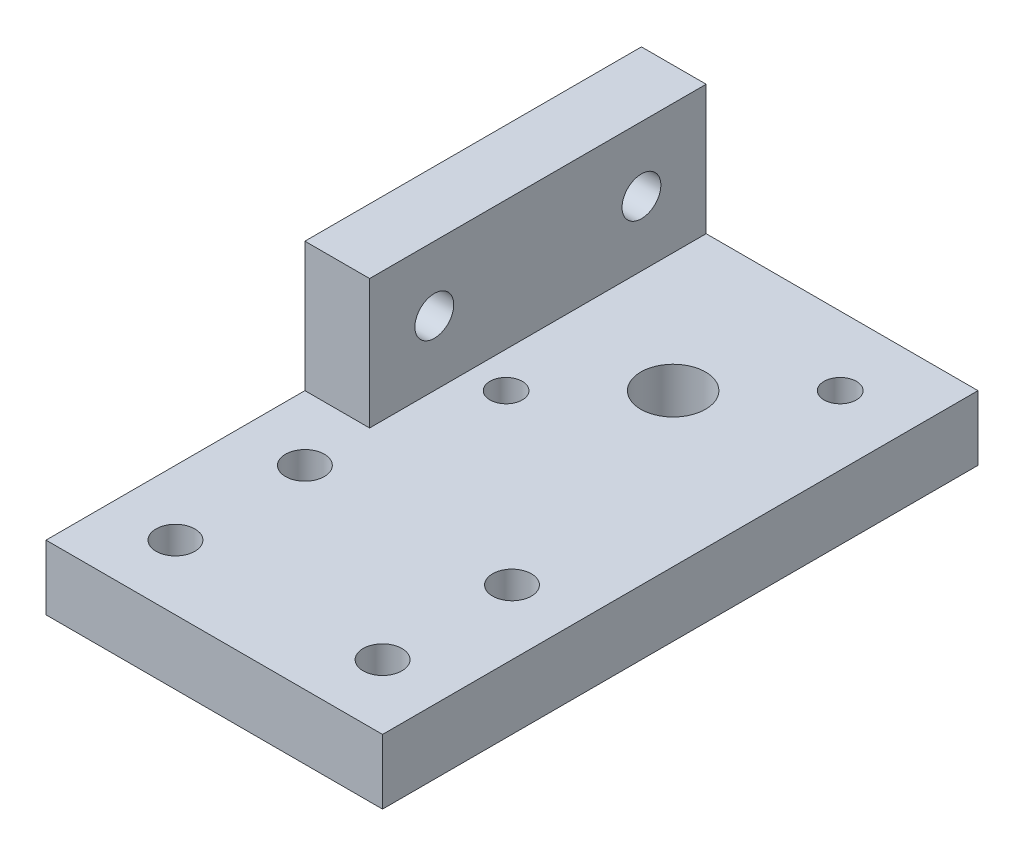
ISO-10303-21;
HEADER;
FILE_DESCRIPTION(('STEP AP214'),'2;1');
FILE_NAME('part.step','',(''),(''),'','','');
FILE_SCHEMA(('AUTOMOTIVE_DESIGN { 1 0 10303 214 1 1 1 1 }'));
ENDSEC;
DATA;
#1=APPLICATION_CONTEXT('core data for automotive mechanical design processes');
#2=APPLICATION_PROTOCOL_DEFINITION('international standard','automotive_design',2000,#1);
#3=PRODUCT_CONTEXT('',#1,'mechanical');
#4=PRODUCT('Part','Part','',(#3));
#5=PRODUCT_RELATED_PRODUCT_CATEGORY('part','',(#4));
#6=PRODUCT_DEFINITION_FORMATION('','',#4);
#7=PRODUCT_DEFINITION_CONTEXT('part definition',#1,'design');
#8=PRODUCT_DEFINITION('design','',#6,#7);
#9=PRODUCT_DEFINITION_SHAPE('','',#8);
#10=(LENGTH_UNIT() NAMED_UNIT(*) SI_UNIT(.MILLI.,.METRE.));
#11=(NAMED_UNIT(*) PLANE_ANGLE_UNIT() SI_UNIT($,.RADIAN.));
#12=(NAMED_UNIT(*) SI_UNIT($,.STERADIAN.) SOLID_ANGLE_UNIT());
#13=UNCERTAINTY_MEASURE_WITH_UNIT(LENGTH_MEASURE(1.E-05),#10,'distance_accuracy_value','');
#14=(GEOMETRIC_REPRESENTATION_CONTEXT(3) GLOBAL_UNCERTAINTY_ASSIGNED_CONTEXT((#13)) GLOBAL_UNIT_ASSIGNED_CONTEXT((#10,
#11,#12)) REPRESENTATION_CONTEXT('',''));
#15=CARTESIAN_POINT('',(0.,0.,0.));
#16=DIRECTION('',(0.,0.,1.));
#17=DIRECTION('',(1.,0.,0.));
#18=AXIS2_PLACEMENT_3D('',#15,#16,#17);
#19=CARTESIAN_POINT('',(0.,10.,-92.));
#20=DIRECTION('',(1.,0.,0.));
#21=DIRECTION('',(0.,0.,-1.));
#22=AXIS2_PLACEMENT_3D('',#19,#20,#21);
#23=PLANE('',#22);
#24=CARTESIAN_POINT('',(0.,20.005,-50.));
#25=DIRECTION('',(1.,0.,0.));
#26=DIRECTION('',(0.,0.,-1.));
#27=AXIS2_PLACEMENT_3D('',#24,#25,#26);
#28=CIRCLE('',#27,3.00000000000001);
#29=CARTESIAN_POINT('',(0.,20.005,-53.));
#30=VERTEX_POINT('',#29);
#31=EDGE_CURVE('E243',#30,#30,#28,.F.);
#32=ORIENTED_EDGE('',*,*,#31,.F.);
#33=EDGE_LOOP('',(#32));
#34=FACE_BOUND('',#33,.T.);
#35=CARTESIAN_POINT('',(0.,20.005,-82.));
#36=DIRECTION('',(1.,0.,0.));
#37=DIRECTION('',(0.,0.,-1.));
#38=AXIS2_PLACEMENT_3D('',#35,#36,#37);
#39=CIRCLE('',#38,3.00000000000001);
#40=CARTESIAN_POINT('',(0.,20.005,-85.));
#41=VERTEX_POINT('',#40);
#42=EDGE_CURVE('E255',#41,#41,#39,.F.);
#43=ORIENTED_EDGE('',*,*,#42,.F.);
#44=EDGE_LOOP('',(#43));
#45=FACE_BOUND('',#44,.T.);
#46=DIRECTION('',(0.,0.,1.));
#47=VECTOR('',#46,1.);
#48=CARTESIAN_POINT('',(0.,0.,-92.));
#49=LINE('',#48,#47);
#50=CARTESIAN_POINT('',(0.,0.,-92.));
#51=VERTEX_POINT('',#50);
#52=CARTESIAN_POINT('',(0.,0.,0.));
#53=VERTEX_POINT('',#52);
#54=EDGE_CURVE('E128',#51,#53,#49,.T.);
#55=ORIENTED_EDGE('',*,*,#54,.T.);
#56=DIRECTION('',(0.,-1.,0.));
#57=VECTOR('',#56,1.);
#58=CARTESIAN_POINT('',(0.,10.,0.));
#59=LINE('',#58,#57);
#60=CARTESIAN_POINT('',(0.,10.,0.));
#61=VERTEX_POINT('',#60);
#62=EDGE_CURVE('E11',#61,#53,#59,.T.);
#63=ORIENTED_EDGE('',*,*,#62,.F.);
#64=DIRECTION('',(0.,0.,1.));
#65=VECTOR('',#64,1.);
#66=CARTESIAN_POINT('',(0.,10.,-92.));
#67=LINE('',#66,#65);
#68=CARTESIAN_POINT('',(0.,10.,-40.));
#69=VERTEX_POINT('',#68);
#70=EDGE_CURVE('E126',#69,#61,#67,.T.);
#71=ORIENTED_EDGE('',*,*,#70,.F.);
#72=DIRECTION('',(0.,-1.,0.));
#73=VECTOR('',#72,1.);
#74=CARTESIAN_POINT('',(0.,30.,-40.));
#75=LINE('',#74,#73);
#76=CARTESIAN_POINT('',(0.,30.,-40.));
#77=VERTEX_POINT('',#76);
#78=EDGE_CURVE('E105',#77,#69,#75,.T.);
#79=ORIENTED_EDGE('',*,*,#78,.F.);
#80=DIRECTION('',(0.,0.,1.));
#81=VECTOR('',#80,1.);
#82=CARTESIAN_POINT('',(0.,30.,-92.));
#83=LINE('',#82,#81);
#84=CARTESIAN_POINT('',(0.,30.,-92.));
#85=VERTEX_POINT('',#84);
#86=EDGE_CURVE('E112',#85,#77,#83,.T.);
#87=ORIENTED_EDGE('',*,*,#86,.F.);
#88=DIRECTION('',(0.,-1.,0.));
#89=VECTOR('',#88,1.);
#90=CARTESIAN_POINT('',(0.,10.,-92.));
#91=LINE('',#90,#89);
#92=EDGE_CURVE('E148',#85,#51,#91,.T.);
#93=ORIENTED_EDGE('',*,*,#92,.T.);
#94=EDGE_LOOP('',(#55,#63,#71,#79,#87,#93));
#95=FACE_BOUND('',#94,.T.);
#96=ADVANCED_FACE('F43',(#34,#45,#95),#23,.F.);
#97=CARTESIAN_POINT('',(0.,10.,0.));
#98=DIRECTION('',(0.,0.,-1.));
#99=DIRECTION('',(-1.,0.,0.));
#100=AXIS2_PLACEMENT_3D('',#97,#98,#99);
#101=PLANE('',#100);
#102=DIRECTION('',(1.,0.,0.));
#103=VECTOR('',#102,1.);
#104=CARTESIAN_POINT('',(0.,0.,0.));
#105=LINE('',#104,#103);
#106=CARTESIAN_POINT('',(52.,0.,0.));
#107=VERTEX_POINT('',#106);
#108=EDGE_CURVE('E132',#53,#107,#105,.T.);
#109=ORIENTED_EDGE('',*,*,#108,.T.);
#110=DIRECTION('',(0.,-1.,0.));
#111=VECTOR('',#110,1.);
#112=CARTESIAN_POINT('',(52.,10.,0.));
#113=LINE('',#112,#111);
#114=CARTESIAN_POINT('',(52.,10.,0.));
#115=VERTEX_POINT('',#114);
#116=EDGE_CURVE('E51',#115,#107,#113,.T.);
#117=ORIENTED_EDGE('',*,*,#116,.F.);
#118=DIRECTION('',(1.,0.,0.));
#119=VECTOR('',#118,1.);
#120=CARTESIAN_POINT('',(0.,10.,0.));
#121=LINE('',#120,#119);
#122=EDGE_CURVE('E140',#61,#115,#121,.T.);
#123=ORIENTED_EDGE('',*,*,#122,.F.);
#124=ORIENTED_EDGE('',*,*,#62,.T.);
#125=EDGE_LOOP('',(#109,#117,#123,#124));
#126=FACE_BOUND('',#125,.T.);
#127=ADVANCED_FACE('F178',(#126),#101,.F.);
#128=CARTESIAN_POINT('',(52.,10.,0.));
#129=DIRECTION('',(-1.,0.,0.));
#130=DIRECTION('',(0.,0.,1.));
#131=AXIS2_PLACEMENT_3D('',#128,#129,#130);
#132=PLANE('',#131);
#133=DIRECTION('',(0.,0.,-1.));
#134=VECTOR('',#133,1.);
#135=CARTESIAN_POINT('',(52.,0.,0.));
#136=LINE('',#135,#134);
#137=CARTESIAN_POINT('',(52.,0.,-92.));
#138=VERTEX_POINT('',#137);
#139=EDGE_CURVE('E152',#107,#138,#136,.T.);
#140=ORIENTED_EDGE('',*,*,#139,.T.);
#141=DIRECTION('',(0.,-1.,0.));
#142=VECTOR('',#141,1.);
#143=CARTESIAN_POINT('',(52.,10.,-92.));
#144=LINE('',#143,#142);
#145=CARTESIAN_POINT('',(52.,10.,-92.));
#146=VERTEX_POINT('',#145);
#147=EDGE_CURVE('E159',#146,#138,#144,.T.);
#148=ORIENTED_EDGE('',*,*,#147,.F.);
#149=DIRECTION('',(0.,0.,-1.));
#150=VECTOR('',#149,1.);
#151=CARTESIAN_POINT('',(52.,10.,0.));
#152=LINE('',#151,#150);
#153=EDGE_CURVE('E144',#115,#146,#152,.T.);
#154=ORIENTED_EDGE('',*,*,#153,.F.);
#155=ORIENTED_EDGE('',*,*,#116,.T.);
#156=EDGE_LOOP('',(#140,#148,#154,#155));
#157=FACE_BOUND('',#156,.T.);
#158=ADVANCED_FACE('F168',(#157),#132,.F.);
#159=CARTESIAN_POINT('',(52.,10.,-92.));
#160=DIRECTION('',(0.,0.,1.));
#161=DIRECTION('',(1.,0.,0.));
#162=AXIS2_PLACEMENT_3D('',#159,#160,#161);
#163=PLANE('',#162);
#164=DIRECTION('',(-1.,0.,0.));
#165=VECTOR('',#164,1.);
#166=CARTESIAN_POINT('',(52.,0.,-92.));
#167=LINE('',#166,#165);
#168=EDGE_CURVE('E141',#138,#51,#167,.T.);
#169=ORIENTED_EDGE('',*,*,#168,.T.);
#170=ORIENTED_EDGE('',*,*,#92,.F.);
#171=DIRECTION('',(-1.,0.,0.));
#172=VECTOR('',#171,1.);
#173=CARTESIAN_POINT('',(0.,30.,-92.));
#174=LINE('',#173,#172);
#175=CARTESIAN_POINT('',(10.,30.,-92.));
#176=VERTEX_POINT('',#175);
#177=EDGE_CURVE('E118',#176,#85,#174,.T.);
#178=ORIENTED_EDGE('',*,*,#177,.F.);
#179=DIRECTION('',(0.,-1.,0.));
#180=VECTOR('',#179,1.);
#181=CARTESIAN_POINT('',(10.,30.,-92.));
#182=LINE('',#181,#180);
#183=CARTESIAN_POINT('',(10.,10.,-92.));
#184=VERTEX_POINT('',#183);
#185=EDGE_CURVE('E134',#176,#184,#182,.T.);
#186=ORIENTED_EDGE('',*,*,#185,.T.);
#187=DIRECTION('',(-1.,0.,0.));
#188=VECTOR('',#187,1.);
#189=CARTESIAN_POINT('',(52.,10.,-92.));
#190=LINE('',#189,#188);
#191=EDGE_CURVE('E58',#146,#184,#190,.T.);
#192=ORIENTED_EDGE('',*,*,#191,.F.);
#193=ORIENTED_EDGE('',*,*,#147,.T.);
#194=EDGE_LOOP('',(#169,#170,#178,#186,#192,#193));
#195=FACE_BOUND('',#194,.T.);
#196=ADVANCED_FACE('F177',(#195),#163,.F.);
#197=CARTESIAN_POINT('',(0.,10.,0.));
#198=DIRECTION('',(0.,1.,0.));
#199=DIRECTION('',(0.,0.,1.));
#200=AXIS2_PLACEMENT_3D('',#197,#198,#199);
#201=PLANE('',#200);
#202=CARTESIAN_POINT('',(28.45,10.,-68.45));
#203=DIRECTION('',(0.,1.,0.));
#204=DIRECTION('',(0.,0.,1.));
#205=AXIS2_PLACEMENT_3D('',#202,#203,#204);
#206=CIRCLE('',#205,5.00000000000001);
#207=CARTESIAN_POINT('',(28.45,10.,-63.45));
#208=VERTEX_POINT('',#207);
#209=EDGE_CURVE('E218',#208,#208,#206,.T.);
#210=ORIENTED_EDGE('',*,*,#209,.F.);
#211=EDGE_LOOP('',(#210));
#212=FACE_BOUND('',#211,.T.);
#213=CARTESIAN_POINT('',(10.,10.,-10.));
#214=DIRECTION('',(0.,1.,0.));
#215=DIRECTION('',(0.,0.,1.));
#216=AXIS2_PLACEMENT_3D('',#213,#214,#215);
#217=CIRCLE('',#216,3.);
#218=CARTESIAN_POINT('',(10.,10.,-7.));
#219=VERTEX_POINT('',#218);
#220=EDGE_CURVE('E211',#219,#219,#217,.T.);
#221=ORIENTED_EDGE('',*,*,#220,.F.);
#222=EDGE_LOOP('',(#221));
#223=FACE_BOUND('',#222,.T.);
#224=CARTESIAN_POINT('',(42.,10.,-10.));
#225=DIRECTION('',(0.,1.,0.));
#226=DIRECTION('',(0.,0.,1.));
#227=AXIS2_PLACEMENT_3D('',#224,#225,#226);
#228=CIRCLE('',#227,3.);
#229=CARTESIAN_POINT('',(42.,10.,-7.));
#230=VERTEX_POINT('',#229);
#231=EDGE_CURVE('E202',#230,#230,#228,.T.);
#232=ORIENTED_EDGE('',*,*,#231,.F.);
#233=EDGE_LOOP('',(#232));
#234=FACE_BOUND('',#233,.T.);
#235=CARTESIAN_POINT('',(10.,10.,-30.));
#236=DIRECTION('',(0.,1.,0.));
#237=DIRECTION('',(0.,0.,1.));
#238=AXIS2_PLACEMENT_3D('',#235,#236,#237);
#239=CIRCLE('',#238,3.);
#240=CARTESIAN_POINT('',(10.,10.,-27.));
#241=VERTEX_POINT('',#240);
#242=EDGE_CURVE('E201',#241,#241,#239,.T.);
#243=ORIENTED_EDGE('',*,*,#242,.F.);
#244=EDGE_LOOP('',(#243));
#245=FACE_BOUND('',#244,.T.);
#246=CARTESIAN_POINT('',(41.3546987566545,10.,-81.3546987566545));
#247=DIRECTION('',(0.,1.,0.));
#248=DIRECTION('',(0.,0.,1.));
#249=AXIS2_PLACEMENT_3D('',#246,#247,#248);
#250=CIRCLE('',#249,2.5);
#251=CARTESIAN_POINT('',(41.3546987566545,10.,-78.8546987566545));
#252=VERTEX_POINT('',#251);
#253=EDGE_CURVE('E227',#252,#252,#250,.T.);
#254=ORIENTED_EDGE('',*,*,#253,.F.);
#255=EDGE_LOOP('',(#254));
#256=FACE_BOUND('',#255,.T.);
#257=CARTESIAN_POINT('',(15.5453012433455,10.,-55.5453012433455));
#258=DIRECTION('',(0.,1.,0.));
#259=DIRECTION('',(0.,0.,1.));
#260=AXIS2_PLACEMENT_3D('',#257,#258,#259);
#261=CIRCLE('',#260,2.5);
#262=CARTESIAN_POINT('',(15.5453012433455,10.,-53.0453012433455));
#263=VERTEX_POINT('',#262);
#264=EDGE_CURVE('E234',#263,#263,#261,.T.);
#265=ORIENTED_EDGE('',*,*,#264,.F.);
#266=EDGE_LOOP('',(#265));
#267=FACE_BOUND('',#266,.T.);
#268=CARTESIAN_POINT('',(42.,10.,-30.));
#269=DIRECTION('',(0.,1.,0.));
#270=DIRECTION('',(0.,0.,1.));
#271=AXIS2_PLACEMENT_3D('',#268,#269,#270);
#272=CIRCLE('',#271,2.99999999999999);
#273=CARTESIAN_POINT('',(42.,10.,-27.));
#274=VERTEX_POINT('',#273);
#275=EDGE_CURVE('E197',#274,#274,#272,.T.);
#276=ORIENTED_EDGE('',*,*,#275,.F.);
#277=EDGE_LOOP('',(#276));
#278=FACE_BOUND('',#277,.T.);
#279=DIRECTION('',(0.,0.,-1.));
#280=VECTOR('',#279,1.);
#281=CARTESIAN_POINT('',(10.,10.,-92.));
#282=LINE('',#281,#280);
#283=CARTESIAN_POINT('',(10.,10.,-40.));
#284=VERTEX_POINT('',#283);
#285=EDGE_CURVE('E122',#284,#184,#282,.T.);
#286=ORIENTED_EDGE('',*,*,#285,.F.);
#287=DIRECTION('',(1.,0.,0.));
#288=VECTOR('',#287,1.);
#289=CARTESIAN_POINT('',(0.,10.,-40.));
#290=LINE('',#289,#288);
#291=EDGE_CURVE('E64',#69,#284,#290,.T.);
#292=ORIENTED_EDGE('',*,*,#291,.F.);
#293=ORIENTED_EDGE('',*,*,#70,.T.);
#294=ORIENTED_EDGE('',*,*,#122,.T.);
#295=ORIENTED_EDGE('',*,*,#153,.T.);
#296=ORIENTED_EDGE('',*,*,#191,.T.);
#297=EDGE_LOOP('',(#286,#292,#293,#294,#295,#296));
#298=FACE_BOUND('',#297,.T.);
#299=ADVANCED_FACE('F179',(#212,#223,#234,#245,#256,#267,#278,#298),#201,.T.);
#300=CARTESIAN_POINT('',(0.,0.,0.));
#301=DIRECTION('',(0.,1.,0.));
#302=DIRECTION('',(0.,0.,1.));
#303=AXIS2_PLACEMENT_3D('',#300,#301,#302);
#304=PLANE('',#303);
#305=CARTESIAN_POINT('',(28.45,0.,-68.45));
#306=DIRECTION('',(0.,1.,0.));
#307=DIRECTION('',(0.,0.,1.));
#308=AXIS2_PLACEMENT_3D('',#305,#306,#307);
#309=CIRCLE('',#308,5.00000000000001);
#310=CARTESIAN_POINT('',(28.45,0.,-63.45));
#311=VERTEX_POINT('',#310);
#312=EDGE_CURVE('E223',#311,#311,#309,.F.);
#313=ORIENTED_EDGE('',*,*,#312,.F.);
#314=EDGE_LOOP('',(#313));
#315=FACE_BOUND('',#314,.T.);
#316=CARTESIAN_POINT('',(10.,0.,-10.));
#317=DIRECTION('',(0.,1.,0.));
#318=DIRECTION('',(0.,0.,1.));
#319=AXIS2_PLACEMENT_3D('',#316,#317,#318);
#320=CIRCLE('',#319,3.);
#321=CARTESIAN_POINT('',(10.,0.,-7.));
#322=VERTEX_POINT('',#321);
#323=EDGE_CURVE('E222',#322,#322,#320,.F.);
#324=ORIENTED_EDGE('',*,*,#323,.F.);
#325=EDGE_LOOP('',(#324));
#326=FACE_BOUND('',#325,.T.);
#327=CARTESIAN_POINT('',(42.,0.,-10.));
#328=DIRECTION('',(0.,1.,0.));
#329=DIRECTION('',(0.,0.,1.));
#330=AXIS2_PLACEMENT_3D('',#327,#328,#329);
#331=CIRCLE('',#330,3.);
#332=CARTESIAN_POINT('',(42.,0.,-7.));
#333=VERTEX_POINT('',#332);
#334=EDGE_CURVE('E207',#333,#333,#331,.F.);
#335=ORIENTED_EDGE('',*,*,#334,.F.);
#336=EDGE_LOOP('',(#335));
#337=FACE_BOUND('',#336,.T.);
#338=CARTESIAN_POINT('',(10.,0.,-30.));
#339=DIRECTION('',(0.,1.,0.));
#340=DIRECTION('',(0.,0.,1.));
#341=AXIS2_PLACEMENT_3D('',#338,#339,#340);
#342=CIRCLE('',#341,3.);
#343=CARTESIAN_POINT('',(10.,0.,-27.));
#344=VERTEX_POINT('',#343);
#345=EDGE_CURVE('E206',#344,#344,#342,.F.);
#346=ORIENTED_EDGE('',*,*,#345,.F.);
#347=EDGE_LOOP('',(#346));
#348=FACE_BOUND('',#347,.T.);
#349=CARTESIAN_POINT('',(41.3546987566545,0.,-81.3546987566545));
#350=DIRECTION('',(0.,1.,0.));
#351=DIRECTION('',(0.,0.,1.));
#352=AXIS2_PLACEMENT_3D('',#349,#350,#351);
#353=CIRCLE('',#352,2.5);
#354=CARTESIAN_POINT('',(41.3546987566545,0.,-78.8546987566545));
#355=VERTEX_POINT('',#354);
#356=EDGE_CURVE('E238',#355,#355,#353,.F.);
#357=ORIENTED_EDGE('',*,*,#356,.F.);
#358=EDGE_LOOP('',(#357));
#359=FACE_BOUND('',#358,.T.);
#360=CARTESIAN_POINT('',(15.5453012433455,0.,-55.5453012433455));
#361=DIRECTION('',(0.,1.,0.));
#362=DIRECTION('',(0.,0.,1.));
#363=AXIS2_PLACEMENT_3D('',#360,#361,#362);
#364=CIRCLE('',#363,2.5);
#365=CARTESIAN_POINT('',(15.5453012433455,0.,-53.0453012433455));
#366=VERTEX_POINT('',#365);
#367=EDGE_CURVE('E239',#366,#366,#364,.F.);
#368=ORIENTED_EDGE('',*,*,#367,.F.);
#369=EDGE_LOOP('',(#368));
#370=FACE_BOUND('',#369,.T.);
#371=CARTESIAN_POINT('',(42.,0.,-30.));
#372=DIRECTION('',(0.,1.,0.));
#373=DIRECTION('',(0.,0.,1.));
#374=AXIS2_PLACEMENT_3D('',#371,#372,#373);
#375=CIRCLE('',#374,2.99999999999999);
#376=CARTESIAN_POINT('',(42.,0.,-27.));
#377=VERTEX_POINT('',#376);
#378=EDGE_CURVE('E190',#377,#377,#375,.F.);
#379=ORIENTED_EDGE('',*,*,#378,.F.);
#380=EDGE_LOOP('',(#379));
#381=FACE_BOUND('',#380,.T.);
#382=ORIENTED_EDGE('',*,*,#54,.F.);
#383=ORIENTED_EDGE('',*,*,#168,.F.);
#384=ORIENTED_EDGE('',*,*,#139,.F.);
#385=ORIENTED_EDGE('',*,*,#108,.F.);
#386=EDGE_LOOP('',(#382,#383,#384,#385));
#387=FACE_BOUND('',#386,.T.);
#388=ADVANCED_FACE('F175',(#315,#326,#337,#348,#359,#370,#381,#387),#304,.F.);
#389=CARTESIAN_POINT('',(0.,30.,-40.));
#390=DIRECTION('',(0.,0.,-1.));
#391=DIRECTION('',(-1.,0.,0.));
#392=AXIS2_PLACEMENT_3D('',#389,#390,#391);
#393=PLANE('',#392);
#394=ORIENTED_EDGE('',*,*,#291,.T.);
#395=DIRECTION('',(0.,-1.,0.));
#396=VECTOR('',#395,1.);
#397=CARTESIAN_POINT('',(10.,30.,-40.));
#398=LINE('',#397,#396);
#399=CARTESIAN_POINT('',(10.,30.,-40.));
#400=VERTEX_POINT('',#399);
#401=EDGE_CURVE('E107',#400,#284,#398,.T.);
#402=ORIENTED_EDGE('',*,*,#401,.F.);
#403=DIRECTION('',(1.,0.,0.));
#404=VECTOR('',#403,1.);
#405=CARTESIAN_POINT('',(0.,30.,-40.));
#406=LINE('',#405,#404);
#407=EDGE_CURVE('E101',#77,#400,#406,.T.);
#408=ORIENTED_EDGE('',*,*,#407,.F.);
#409=ORIENTED_EDGE('',*,*,#78,.T.);
#410=EDGE_LOOP('',(#394,#402,#408,#409));
#411=FACE_BOUND('',#410,.T.);
#412=ADVANCED_FACE('F103',(#411),#393,.F.);
#413=CARTESIAN_POINT('',(10.,30.,-92.));
#414=DIRECTION('',(-1.,0.,0.));
#415=DIRECTION('',(0.,0.,1.));
#416=AXIS2_PLACEMENT_3D('',#413,#414,#415);
#417=PLANE('',#416);
#418=CARTESIAN_POINT('',(10.,20.005,-50.));
#419=DIRECTION('',(1.,0.,0.));
#420=DIRECTION('',(0.,0.,-1.));
#421=AXIS2_PLACEMENT_3D('',#418,#419,#420);
#422=CIRCLE('',#421,3.00000000000001);
#423=CARTESIAN_POINT('',(10.,20.005,-53.));
#424=VERTEX_POINT('',#423);
#425=EDGE_CURVE('E254',#424,#424,#422,.T.);
#426=ORIENTED_EDGE('',*,*,#425,.F.);
#427=EDGE_LOOP('',(#426));
#428=FACE_BOUND('',#427,.T.);
#429=CARTESIAN_POINT('',(10.,20.005,-82.));
#430=DIRECTION('',(1.,0.,0.));
#431=DIRECTION('',(0.,0.,-1.));
#432=AXIS2_PLACEMENT_3D('',#429,#430,#431);
#433=CIRCLE('',#432,3.00000000000001);
#434=CARTESIAN_POINT('',(10.,20.005,-85.));
#435=VERTEX_POINT('',#434);
#436=EDGE_CURVE('E250',#435,#435,#433,.T.);
#437=ORIENTED_EDGE('',*,*,#436,.F.);
#438=EDGE_LOOP('',(#437));
#439=FACE_BOUND('',#438,.T.);
#440=ORIENTED_EDGE('',*,*,#285,.T.);
#441=ORIENTED_EDGE('',*,*,#185,.F.);
#442=DIRECTION('',(0.,0.,-1.));
#443=VECTOR('',#442,1.);
#444=CARTESIAN_POINT('',(10.,30.,-92.));
#445=LINE('',#444,#443);
#446=EDGE_CURVE('E111',#400,#176,#445,.T.);
#447=ORIENTED_EDGE('',*,*,#446,.F.);
#448=ORIENTED_EDGE('',*,*,#401,.T.);
#449=EDGE_LOOP('',(#440,#441,#447,#448));
#450=FACE_BOUND('',#449,.T.);
#451=ADVANCED_FACE('F269',(#428,#439,#450),#417,.F.);
#452=CARTESIAN_POINT('',(0.,30.,0.));
#453=DIRECTION('',(0.,1.,0.));
#454=DIRECTION('',(0.,0.,1.));
#455=AXIS2_PLACEMENT_3D('',#452,#453,#454);
#456=PLANE('',#455);
#457=ORIENTED_EDGE('',*,*,#86,.T.);
#458=ORIENTED_EDGE('',*,*,#407,.T.);
#459=ORIENTED_EDGE('',*,*,#446,.T.);
#460=ORIENTED_EDGE('',*,*,#177,.T.);
#461=EDGE_LOOP('',(#457,#458,#459,#460));
#462=FACE_BOUND('',#461,.T.);
#463=ADVANCED_FACE('F116',(#462),#456,.T.);
#464=CARTESIAN_POINT('',(42.,-0.000999999999999265,-30.));
#465=DIRECTION('',(0.,1.,0.));
#466=DIRECTION('',(0.,0.,1.));
#467=AXIS2_PLACEMENT_3D('',#464,#465,#466);
#468=CYLINDRICAL_SURFACE('',#467,2.99999999999999);
#469=ORIENTED_EDGE('',*,*,#275,.T.);
#470=EDGE_LOOP('',(#469));
#471=FACE_BOUND('',#470,.T.);
#472=ORIENTED_EDGE('',*,*,#378,.T.);
#473=EDGE_LOOP('',(#472));
#474=FACE_BOUND('',#473,.T.);
#475=ADVANCED_FACE('F301',(#471,#474),#468,.F.);
#476=CARTESIAN_POINT('',(15.5453012433455,-0.000999999999999265,-55.5453012433455));
#477=DIRECTION('',(0.,1.,0.));
#478=DIRECTION('',(0.,0.,1.));
#479=AXIS2_PLACEMENT_3D('',#476,#477,#478);
#480=CYLINDRICAL_SURFACE('',#479,2.5);
#481=ORIENTED_EDGE('',*,*,#264,.T.);
#482=EDGE_LOOP('',(#481));
#483=FACE_BOUND('',#482,.T.);
#484=ORIENTED_EDGE('',*,*,#367,.T.);
#485=EDGE_LOOP('',(#484));
#486=FACE_BOUND('',#485,.T.);
#487=ADVANCED_FACE('F297',(#483,#486),#480,.F.);
#488=CARTESIAN_POINT('',(41.3546987566545,-0.000999999999999265,-81.3546987566545));
#489=DIRECTION('',(0.,1.,0.));
#490=DIRECTION('',(0.,0.,1.));
#491=AXIS2_PLACEMENT_3D('',#488,#489,#490);
#492=CYLINDRICAL_SURFACE('',#491,2.5);
#493=ORIENTED_EDGE('',*,*,#253,.T.);
#494=EDGE_LOOP('',(#493));
#495=FACE_BOUND('',#494,.T.);
#496=ORIENTED_EDGE('',*,*,#356,.T.);
#497=EDGE_LOOP('',(#496));
#498=FACE_BOUND('',#497,.T.);
#499=ADVANCED_FACE('F293',(#495,#498),#492,.F.);
#500=CARTESIAN_POINT('',(10.,-0.000999999999999265,-30.));
#501=DIRECTION('',(0.,1.,0.));
#502=DIRECTION('',(0.,0.,1.));
#503=AXIS2_PLACEMENT_3D('',#500,#501,#502);
#504=CYLINDRICAL_SURFACE('',#503,3.);
#505=ORIENTED_EDGE('',*,*,#242,.T.);
#506=EDGE_LOOP('',(#505));
#507=FACE_BOUND('',#506,.T.);
#508=ORIENTED_EDGE('',*,*,#345,.T.);
#509=EDGE_LOOP('',(#508));
#510=FACE_BOUND('',#509,.T.);
#511=ADVANCED_FACE('F296',(#507,#510),#504,.F.);
#512=CARTESIAN_POINT('',(42.,-0.000999999999999265,-10.));
#513=DIRECTION('',(0.,1.,0.));
#514=DIRECTION('',(0.,0.,1.));
#515=AXIS2_PLACEMENT_3D('',#512,#513,#514);
#516=CYLINDRICAL_SURFACE('',#515,3.);
#517=ORIENTED_EDGE('',*,*,#231,.T.);
#518=EDGE_LOOP('',(#517));
#519=FACE_BOUND('',#518,.T.);
#520=ORIENTED_EDGE('',*,*,#334,.T.);
#521=EDGE_LOOP('',(#520));
#522=FACE_BOUND('',#521,.T.);
#523=ADVANCED_FACE('F306',(#519,#522),#516,.F.);
#524=CARTESIAN_POINT('',(10.,-0.000999999999999265,-10.));
#525=DIRECTION('',(0.,1.,0.));
#526=DIRECTION('',(0.,0.,1.));
#527=AXIS2_PLACEMENT_3D('',#524,#525,#526);
#528=CYLINDRICAL_SURFACE('',#527,3.);
#529=ORIENTED_EDGE('',*,*,#220,.T.);
#530=EDGE_LOOP('',(#529));
#531=FACE_BOUND('',#530,.T.);
#532=ORIENTED_EDGE('',*,*,#323,.T.);
#533=EDGE_LOOP('',(#532));
#534=FACE_BOUND('',#533,.T.);
#535=ADVANCED_FACE('F303',(#531,#534),#528,.F.);
#536=CARTESIAN_POINT('',(28.45,-0.000999999999999265,-68.45));
#537=DIRECTION('',(0.,1.,0.));
#538=DIRECTION('',(0.,0.,1.));
#539=AXIS2_PLACEMENT_3D('',#536,#537,#538);
#540=CYLINDRICAL_SURFACE('',#539,5.00000000000001);
#541=ORIENTED_EDGE('',*,*,#209,.T.);
#542=EDGE_LOOP('',(#541));
#543=FACE_BOUND('',#542,.T.);
#544=ORIENTED_EDGE('',*,*,#312,.T.);
#545=EDGE_LOOP('',(#544));
#546=FACE_BOUND('',#545,.T.);
#547=ADVANCED_FACE('F278',(#543,#546),#540,.F.);
#548=CARTESIAN_POINT('',(-0.00100000000001488,20.005,-82.));
#549=DIRECTION('',(1.,0.,0.));
#550=DIRECTION('',(0.,0.,-1.));
#551=AXIS2_PLACEMENT_3D('',#548,#549,#550);
#552=CYLINDRICAL_SURFACE('',#551,3.00000000000001);
#553=ORIENTED_EDGE('',*,*,#436,.T.);
#554=EDGE_LOOP('',(#553));
#555=FACE_BOUND('',#554,.T.);
#556=ORIENTED_EDGE('',*,*,#42,.T.);
#557=EDGE_LOOP('',(#556));
#558=FACE_BOUND('',#557,.T.);
#559=ADVANCED_FACE('F275',(#555,#558),#552,.F.);
#560=CARTESIAN_POINT('',(-0.00100000000000967,20.005,-50.));
#561=DIRECTION('',(1.,0.,0.));
#562=DIRECTION('',(0.,0.,-1.));
#563=AXIS2_PLACEMENT_3D('',#560,#561,#562);
#564=CYLINDRICAL_SURFACE('',#563,3.00000000000001);
#565=ORIENTED_EDGE('',*,*,#425,.T.);
#566=EDGE_LOOP('',(#565));
#567=FACE_BOUND('',#566,.T.);
#568=ORIENTED_EDGE('',*,*,#31,.T.);
#569=EDGE_LOOP('',(#568));
#570=FACE_BOUND('',#569,.T.);
#571=ADVANCED_FACE('F266',(#567,#570),#564,.F.);
#572=CLOSED_SHELL('',(#96,#127,#158,#196,#299,#388,#412,#451,#463,#475,#487,#499,#511,#523,#535,
#547,#559,#571));
#573=MANIFOLD_SOLID_BREP('B2',#572);
#574=ADVANCED_BREP_SHAPE_REPRESENTATION('',(#18,#573),#14);
#575=SHAPE_DEFINITION_REPRESENTATION(#9,#574);
ENDSEC;
END-ISO-10303-21;
